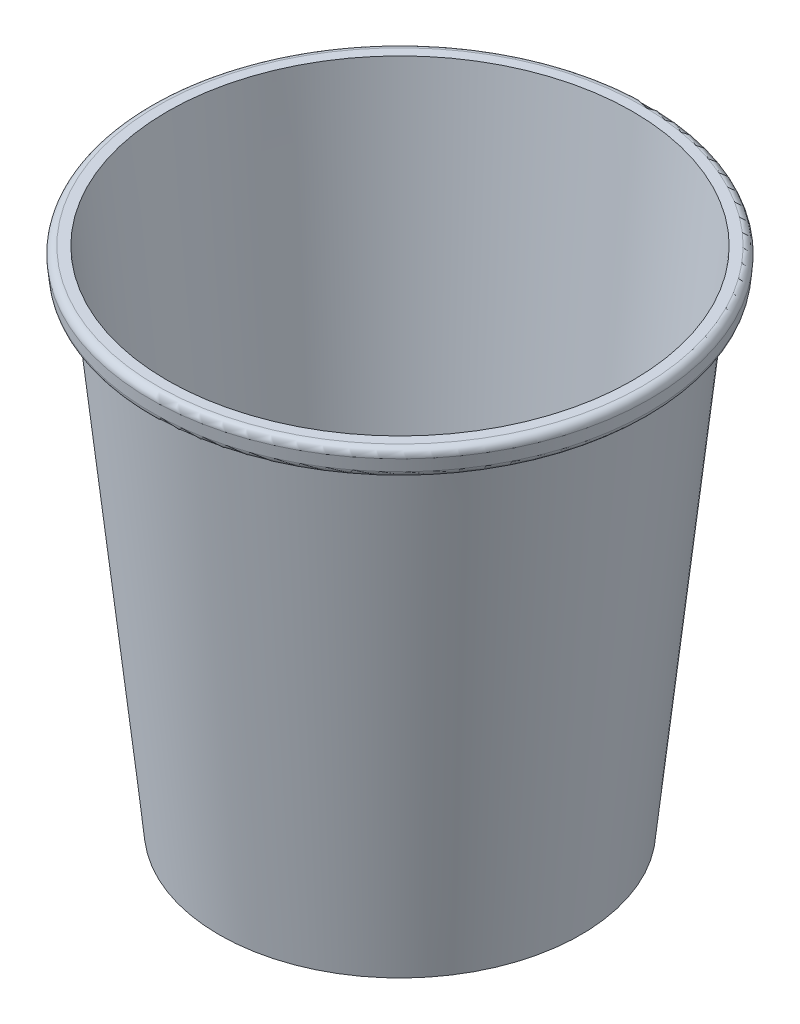
ISO-10303-21;
HEADER;
FILE_DESCRIPTION(('STEP AP214'),'2;1');
FILE_NAME('part.step','',(''),(''),'','','');
FILE_SCHEMA(('AUTOMOTIVE_DESIGN { 1 0 10303 214 1 1 1 1 }'));
ENDSEC;
DATA;
#1=APPLICATION_CONTEXT('core data for automotive mechanical design processes');
#2=APPLICATION_PROTOCOL_DEFINITION('international standard','automotive_design',2000,#1);
#3=PRODUCT_CONTEXT('',#1,'mechanical');
#4=PRODUCT('Part','Part','',(#3));
#5=PRODUCT_RELATED_PRODUCT_CATEGORY('part','',(#4));
#6=PRODUCT_DEFINITION_FORMATION('','',#4);
#7=PRODUCT_DEFINITION_CONTEXT('part definition',#1,'design');
#8=PRODUCT_DEFINITION('design','',#6,#7);
#9=PRODUCT_DEFINITION_SHAPE('','',#8);
#10=(LENGTH_UNIT() NAMED_UNIT(*) SI_UNIT(.MILLI.,.METRE.));
#11=(NAMED_UNIT(*) PLANE_ANGLE_UNIT() SI_UNIT($,.RADIAN.));
#12=(NAMED_UNIT(*) SI_UNIT($,.STERADIAN.) SOLID_ANGLE_UNIT());
#13=UNCERTAINTY_MEASURE_WITH_UNIT(LENGTH_MEASURE(1.E-05),#10,'distance_accuracy_value','');
#14=(GEOMETRIC_REPRESENTATION_CONTEXT(3) GLOBAL_UNCERTAINTY_ASSIGNED_CONTEXT((#13)) GLOBAL_UNIT_ASSIGNED_CONTEXT((#10,
#11,#12)) REPRESENTATION_CONTEXT('',''));
#15=CARTESIAN_POINT('',(0.,0.,0.));
#16=DIRECTION('',(0.,0.,1.));
#17=DIRECTION('',(1.,0.,0.));
#18=AXIS2_PLACEMENT_3D('',#15,#16,#17);
#19=CARTESIAN_POINT('',(0.,-0.0266084031292856,0.));
#20=DIRECTION('',(0.,1.,0.));
#21=DIRECTION('',(0.,0.,1.));
#22=AXIS2_PLACEMENT_3D('',#19,#20,#21);
#23=CONICAL_SURFACE('',#22,32.320102440374,0.10495004883392);
#24=CARTESIAN_POINT('',(0.,0.,0.));
#25=DIRECTION('',(0.,1.,0.));
#26=DIRECTION('',(0.,0.,1.));
#27=AXIS2_PLACEMENT_3D('',#24,#25,#26);
#28=CIRCLE('',#27,32.3229052918272);
#29=CARTESIAN_POINT('',(0.,0.,32.3229052918272));
#30=VERTEX_POINT('',#29);
#31=EDGE_CURVE('E57',#30,#30,#28,.T.);
#32=ORIENTED_EDGE('',*,*,#31,.T.);
#33=EDGE_LOOP('',(#32));
#34=FACE_BOUND('',#33,.T.);
#35=CARTESIAN_POINT('',(0.,90.17,0.));
#36=DIRECTION('',(0.,1.,0.));
#37=DIRECTION('',(0.,0.,1.));
#38=AXIS2_PLACEMENT_3D('',#35,#36,#37);
#39=CIRCLE('',#38,41.8211496738497);
#40=CARTESIAN_POINT('',(41.8211496738497,90.1700000000003,0.));
#41=VERTEX_POINT('',#40);
#42=EDGE_CURVE('E12',#41,#41,#39,.F.);
#43=ORIENTED_EDGE('',*,*,#42,.T.);
#44=EDGE_LOOP('',(#43));
#45=FACE_BOUND('',#44,.T.);
#46=ADVANCED_FACE('F49',(#34,#45),#23,.T.);
#47=CARTESIAN_POINT('',(0.,0.,0.));
#48=DIRECTION('',(0.,1.,0.));
#49=DIRECTION('',(0.,0.,1.));
#50=AXIS2_PLACEMENT_3D('',#47,#48,#49);
#51=PLANE('',#50);
#52=ORIENTED_EDGE('',*,*,#31,.F.);
#53=EDGE_LOOP('',(#52));
#54=FACE_BOUND('',#53,.T.);
#55=CARTESIAN_POINT('',(0.,0.,0.));
#56=DIRECTION('',(0.,1.,0.));
#57=DIRECTION('',(0.,0.,1.));
#58=AXIS2_PLACEMENT_3D('',#55,#56,#57);
#59=CIRCLE('',#58,32.0675);
#60=CARTESIAN_POINT('',(0.,0.,32.0675));
#61=VERTEX_POINT('',#60);
#62=EDGE_CURVE('E179',#61,#61,#59,.T.);
#63=ORIENTED_EDGE('',*,*,#62,.T.);
#64=EDGE_LOOP('',(#63));
#65=FACE_BOUND('',#64,.T.);
#66=ADVANCED_FACE('F188',(#54,#65),#51,.F.);
#67=CARTESIAN_POINT('',(0.,90.424,0.));
#68=DIRECTION('',(0.,1.,0.));
#69=DIRECTION('',(0.,0.,1.));
#70=AXIS2_PLACEMENT_3D('',#67,#68,#69);
#71=PLANE('',#70);
#72=CARTESIAN_POINT('',(0.,90.424,0.));
#73=DIRECTION('',(0.,1.,0.));
#74=DIRECTION('',(0.,0.,1.));
#75=AXIS2_PLACEMENT_3D('',#72,#73,#74);
#76=CIRCLE('',#75,41.5925);
#77=CARTESIAN_POINT('',(0.,90.424,41.5925));
#78=VERTEX_POINT('',#77);
#79=EDGE_CURVE('E174',#78,#78,#76,.T.);
#80=ORIENTED_EDGE('',*,*,#79,.F.);
#81=EDGE_LOOP('',(#80));
#82=FACE_BOUND('',#81,.T.);
#83=CARTESIAN_POINT('',(0.,90.424,0.));
#84=DIRECTION('',(0.,1.,0.));
#85=DIRECTION('',(1.,0.,0.));
#86=AXIS2_PLACEMENT_3D('',#83,#84,#85);
#87=CIRCLE('',#86,43.3566954509761);
#88=CARTESIAN_POINT('',(43.3566954509761,90.424,0.));
#89=VERTEX_POINT('',#88);
#90=EDGE_CURVE('E170',#89,#89,#87,.T.);
#91=ORIENTED_EDGE('',*,*,#90,.T.);
#92=EDGE_LOOP('',(#91));
#93=FACE_BOUND('',#92,.T.);
#94=ADVANCED_FACE('F191',(#82,#93),#71,.T.);
#95=CARTESIAN_POINT('',(0.,0.,0.));
#96=DIRECTION('',(0.,1.,0.));
#97=DIRECTION('',(0.,0.,1.));
#98=AXIS2_PLACEMENT_3D('',#95,#96,#97);
#99=CONICAL_SURFACE('',#98,32.0675,0.10495004883392);
#100=ORIENTED_EDGE('',*,*,#79,.T.);
#101=EDGE_LOOP('',(#100));
#102=FACE_BOUND('',#101,.T.);
#103=ORIENTED_EDGE('',*,*,#62,.F.);
#104=EDGE_LOOP('',(#103));
#105=FACE_BOUND('',#104,.T.);
#106=ADVANCED_FACE('F194',(#102,#105),#99,.F.);
#107=CARTESIAN_POINT('',(41.5925,90.17,0.));
#108=DIRECTION('',(0.,1.,0.));
#109=DIRECTION('',(0.,0.,1.));
#110=AXIS2_PLACEMENT_3D('',#107,#108,#109);
#111=PLANE('',#110);
#112=ORIENTED_EDGE('',*,*,#42,.F.);
#113=EDGE_LOOP('',(#112));
#114=FACE_BOUND('',#113,.T.);
#115=CARTESIAN_POINT('',(0.,90.17,0.));
#116=DIRECTION('',(0.,1.,0.));
#117=DIRECTION('',(1.,0.,0.));
#118=AXIS2_PLACEMENT_3D('',#115,#116,#117);
#119=CIRCLE('',#118,43.3566954509761);
#120=CARTESIAN_POINT('',(43.3566954509761,90.17,0.));
#121=VERTEX_POINT('',#120);
#122=EDGE_CURVE('E101',#121,#121,#119,.T.);
#123=ORIENTED_EDGE('',*,*,#122,.F.);
#124=EDGE_LOOP('',(#123));
#125=FACE_BOUND('',#124,.T.);
#126=ADVANCED_FACE('F100',(#114,#125),#111,.F.);
#127=CARTESIAN_POINT('',(0.,89.154,0.));
#128=DIRECTION('',(0.,1.,0.));
#129=DIRECTION('',(0.,0.,1.));
#130=AXIS2_PLACEMENT_3D('',#127,#128,#129);
#131=TOROIDAL_SURFACE('',#130,43.3566954509761,1.016);
#132=CARTESIAN_POINT('',(43.3566954509761,89.154,0.));
#133=DIRECTION('',(0.,0.,-1.));
#134=DIRECTION('',(1.,0.,0.));
#135=AXIS2_PLACEMENT_3D('',#132,#133,#134);
#136=CIRCLE('',#135,1.016);
#137=CARTESIAN_POINT('',(44.3671052124722,89.0475663874829,0.));
#138=VERTEX_POINT('',#137);
#139=EDGE_CURVE('E104',#121,#138,#136,.T.);
#140=ORIENTED_EDGE('',*,*,#139,.T.);
#141=CARTESIAN_POINT('',(0.,89.0475663874829,0.));
#142=DIRECTION('',(0.,1.,0.));
#143=DIRECTION('',(1.,0.,0.));
#144=AXIS2_PLACEMENT_3D('',#141,#142,#143);
#145=CIRCLE('',#144,44.3671052124722);
#146=EDGE_CURVE('E111',#138,#138,#145,.T.);
#147=ORIENTED_EDGE('',*,*,#146,.F.);
#148=ORIENTED_EDGE('',*,*,#139,.F.);
#149=ORIENTED_EDGE('',*,*,#122,.T.);
#150=EDGE_LOOP('',(#140,#147,#148,#149));
#151=FACE_BOUND('',#150,.T.);
#152=ADVANCED_FACE('F107',(#151),#131,.F.);
#153=CARTESIAN_POINT('',(0.,89.0475663874829,0.));
#154=DIRECTION('',(0.,1.,0.));
#155=DIRECTION('',(0.,0.,1.));
#156=AXIS2_PLACEMENT_3D('',#153,#154,#155);
#157=CONICAL_SURFACE('',#156,44.3671052124722,0.104950048833919);
#158=DIRECTION('',(-0.104757492634982,-0.994497796748103,0.));
#159=VECTOR('',#158,1.);
#160=CARTESIAN_POINT('',(44.3671052124722,89.0475663874829,0.));
#161=LINE('',#160,#159);
#162=CARTESIAN_POINT('',(44.1396824596632,86.8885663874829,0.));
#163=VERTEX_POINT('',#162);
#164=EDGE_CURVE('E121',#138,#163,#161,.T.);
#165=ORIENTED_EDGE('',*,*,#164,.T.);
#166=CARTESIAN_POINT('',(0.,86.8885663874829,0.));
#167=DIRECTION('',(0.,1.,0.));
#168=DIRECTION('',(1.,0.,0.));
#169=AXIS2_PLACEMENT_3D('',#166,#167,#168);
#170=CIRCLE('',#169,44.1396824596632);
#171=EDGE_CURVE('E115',#163,#163,#170,.T.);
#172=ORIENTED_EDGE('',*,*,#171,.F.);
#173=ORIENTED_EDGE('',*,*,#164,.F.);
#174=ORIENTED_EDGE('',*,*,#146,.T.);
#175=EDGE_LOOP('',(#165,#172,#173,#174));
#176=FACE_BOUND('',#175,.T.);
#177=ADVANCED_FACE('F236',(#176),#157,.F.);
#178=CARTESIAN_POINT('',(0.,86.995,0.));
#179=DIRECTION('',(0.,1.,0.));
#180=DIRECTION('',(0.,0.,1.));
#181=AXIS2_PLACEMENT_3D('',#178,#179,#180);
#182=TOROIDAL_SURFACE('',#181,43.1292726981671,1.01599999999999);
#183=CARTESIAN_POINT('',(43.1292726981671,86.995,0.));
#184=DIRECTION('',(0.,0.,-1.));
#185=DIRECTION('',(-1.,0.,0.));
#186=AXIS2_PLACEMENT_3D('',#183,#184,#185);
#187=CIRCLE('',#186,1.01599999999999);
#188=CARTESIAN_POINT('',(43.1292726981671,85.979,0.));
#189=VERTEX_POINT('',#188);
#190=EDGE_CURVE('E125',#163,#189,#187,.T.);
#191=ORIENTED_EDGE('',*,*,#190,.T.);
#192=CARTESIAN_POINT('',(0.,85.979,0.));
#193=DIRECTION('',(0.,1.,0.));
#194=DIRECTION('',(1.,0.,0.));
#195=AXIS2_PLACEMENT_3D('',#192,#193,#194);
#196=CIRCLE('',#195,43.1292726981671);
#197=EDGE_CURVE('E129',#189,#189,#196,.T.);
#198=ORIENTED_EDGE('',*,*,#197,.F.);
#199=ORIENTED_EDGE('',*,*,#190,.F.);
#200=ORIENTED_EDGE('',*,*,#171,.T.);
#201=EDGE_LOOP('',(#191,#198,#199,#200));
#202=FACE_BOUND('',#201,.T.);
#203=ADVANCED_FACE('F245',(#202),#182,.F.);
#204=CARTESIAN_POINT('',(43.1292726981671,85.979,0.));
#205=DIRECTION('',(0.,-1.,0.));
#206=DIRECTION('',(0.,0.,-1.));
#207=AXIS2_PLACEMENT_3D('',#204,#205,#206);
#208=PLANE('',#207);
#209=ORIENTED_EDGE('',*,*,#197,.T.);
#210=EDGE_LOOP('',(#209));
#211=FACE_BOUND('',#210,.T.);
#212=CARTESIAN_POINT('',(0.,85.979,0.));
#213=DIRECTION('',(0.,1.,0.));
#214=DIRECTION('',(1.,0.,0.));
#215=AXIS2_PLACEMENT_3D('',#212,#213,#214);
#216=CIRCLE('',#215,43.0025210674157);
#217=CARTESIAN_POINT('',(43.0025210674157,85.979,0.));
#218=VERTEX_POINT('',#217);
#219=EDGE_CURVE('E136',#218,#218,#216,.T.);
#220=ORIENTED_EDGE('',*,*,#219,.F.);
#221=EDGE_LOOP('',(#220));
#222=FACE_BOUND('',#221,.T.);
#223=ADVANCED_FACE('F255',(#211,#222),#208,.F.);
#224=CARTESIAN_POINT('',(0.,90.424,0.));
#225=DIRECTION('',(0.,1.,0.));
#226=DIRECTION('',(0.,0.,1.));
#227=AXIS2_PLACEMENT_3D('',#224,#225,#226);
#228=CYLINDRICAL_SURFACE('',#227,43.0025210674157);
#229=DIRECTION('',(0.,-1.,0.));
#230=VECTOR('',#229,1.);
#231=CARTESIAN_POINT('',(43.0025210674157,85.725,0.));
#232=LINE('',#231,#230);
#233=CARTESIAN_POINT('',(43.0025210674157,85.725,0.));
#234=VERTEX_POINT('',#233);
#235=EDGE_CURVE('E139',#218,#234,#232,.T.);
#236=ORIENTED_EDGE('',*,*,#235,.T.);
#237=CARTESIAN_POINT('',(0.,85.725,0.));
#238=DIRECTION('',(0.,1.,0.));
#239=DIRECTION('',(1.,0.,0.));
#240=AXIS2_PLACEMENT_3D('',#237,#238,#239);
#241=CIRCLE('',#240,43.0025210674157);
#242=EDGE_CURVE('E143',#234,#234,#241,.T.);
#243=ORIENTED_EDGE('',*,*,#242,.F.);
#244=ORIENTED_EDGE('',*,*,#235,.F.);
#245=ORIENTED_EDGE('',*,*,#219,.T.);
#246=EDGE_LOOP('',(#236,#243,#244,#245));
#247=FACE_BOUND('',#246,.T.);
#248=ADVANCED_FACE('F265',(#247),#228,.F.);
#249=CARTESIAN_POINT('',(43.1292726981671,85.725,0.));
#250=DIRECTION('',(0.,1.,0.));
#251=DIRECTION('',(0.,0.,1.));
#252=AXIS2_PLACEMENT_3D('',#249,#250,#251);
#253=PLANE('',#252);
#254=ORIENTED_EDGE('',*,*,#242,.T.);
#255=EDGE_LOOP('',(#254));
#256=FACE_BOUND('',#255,.T.);
#257=CARTESIAN_POINT('',(0.,85.725,0.));
#258=DIRECTION('',(0.,1.,0.));
#259=DIRECTION('',(1.,0.,0.));
#260=AXIS2_PLACEMENT_3D('',#257,#258,#259);
#261=CIRCLE('',#260,43.1292726981671);
#262=CARTESIAN_POINT('',(43.1292726981671,85.725,0.));
#263=VERTEX_POINT('',#262);
#264=EDGE_CURVE('E150',#263,#263,#261,.T.);
#265=ORIENTED_EDGE('',*,*,#264,.F.);
#266=EDGE_LOOP('',(#265));
#267=FACE_BOUND('',#266,.T.);
#268=ADVANCED_FACE('F275',(#256,#267),#253,.F.);
#269=CARTESIAN_POINT('',(0.,86.995,0.));
#270=DIRECTION('',(0.,1.,0.));
#271=DIRECTION('',(0.,0.,1.));
#272=AXIS2_PLACEMENT_3D('',#269,#270,#271);
#273=TOROIDAL_SURFACE('',#272,43.1292726981671,1.27);
#274=CARTESIAN_POINT('',(43.1292726981671,86.995,0.));
#275=DIRECTION('',(0.,0.,1.));
#276=DIRECTION('',(-1.,0.,0.));
#277=AXIS2_PLACEMENT_3D('',#274,#275,#276);
#278=CIRCLE('',#277,1.27);
#279=CARTESIAN_POINT('',(44.3922849000372,86.8619579843536,0.));
#280=VERTEX_POINT('',#279);
#281=EDGE_CURVE('E153',#263,#280,#278,.T.);
#282=ORIENTED_EDGE('',*,*,#281,.T.);
#283=CARTESIAN_POINT('',(0.,86.8619579843536,0.));
#284=DIRECTION('',(0.,1.,0.));
#285=DIRECTION('',(1.,0.,0.));
#286=AXIS2_PLACEMENT_3D('',#283,#284,#285);
#287=CIRCLE('',#286,44.3922849000372);
#288=EDGE_CURVE('E157',#280,#280,#287,.T.);
#289=ORIENTED_EDGE('',*,*,#288,.F.);
#290=ORIENTED_EDGE('',*,*,#281,.F.);
#291=ORIENTED_EDGE('',*,*,#264,.T.);
#292=EDGE_LOOP('',(#282,#289,#290,#291));
#293=FACE_BOUND('',#292,.T.);
#294=ADVANCED_FACE('F285',(#293),#273,.T.);
#295=CARTESIAN_POINT('',(0.,86.8619579843536,0.));
#296=DIRECTION('',(0.,1.,0.));
#297=DIRECTION('',(0.,0.,1.));
#298=AXIS2_PLACEMENT_3D('',#295,#296,#297);
#299=CONICAL_SURFACE('',#298,44.3922849000372,0.10495004883392);
#300=DIRECTION('',(0.104757492634983,0.994497796748103,0.));
#301=VECTOR('',#300,1.);
#302=CARTESIAN_POINT('',(44.6197076528462,89.0209579843536,0.));
#303=LINE('',#302,#301);
#304=CARTESIAN_POINT('',(44.6197076528462,89.0209579843536,0.));
#305=VERTEX_POINT('',#304);
#306=EDGE_CURVE('E160',#280,#305,#303,.T.);
#307=ORIENTED_EDGE('',*,*,#306,.T.);
#308=CARTESIAN_POINT('',(0.,89.0209579843536,0.));
#309=DIRECTION('',(0.,1.,0.));
#310=DIRECTION('',(1.,0.,0.));
#311=AXIS2_PLACEMENT_3D('',#308,#309,#310);
#312=CIRCLE('',#311,44.6197076528462);
#313=EDGE_CURVE('E164',#305,#305,#312,.T.);
#314=ORIENTED_EDGE('',*,*,#313,.F.);
#315=ORIENTED_EDGE('',*,*,#306,.F.);
#316=ORIENTED_EDGE('',*,*,#288,.T.);
#317=EDGE_LOOP('',(#307,#314,#315,#316));
#318=FACE_BOUND('',#317,.T.);
#319=ADVANCED_FACE('F295',(#318),#299,.T.);
#320=CARTESIAN_POINT('',(0.,89.154,0.));
#321=DIRECTION('',(0.,1.,0.));
#322=DIRECTION('',(0.,0.,1.));
#323=AXIS2_PLACEMENT_3D('',#320,#321,#322);
#324=TOROIDAL_SURFACE('',#323,43.3566954509761,1.27);
#325=CARTESIAN_POINT('',(43.3566954509761,89.154,0.));
#326=DIRECTION('',(0.,0.,1.));
#327=DIRECTION('',(1.,0.,0.));
#328=AXIS2_PLACEMENT_3D('',#325,#326,#327);
#329=CIRCLE('',#328,1.27);
#330=EDGE_CURVE('E117',#305,#89,#329,.T.);
#331=ORIENTED_EDGE('',*,*,#330,.T.);
#332=ORIENTED_EDGE('',*,*,#90,.F.);
#333=ORIENTED_EDGE('',*,*,#330,.F.);
#334=ORIENTED_EDGE('',*,*,#313,.T.);
#335=EDGE_LOOP('',(#331,#332,#333,#334));
#336=FACE_BOUND('',#335,.T.);
#337=ADVANCED_FACE('F305',(#336),#324,.T.);
#338=CLOSED_SHELL('',(#46,#66,#94,#106,#126,#152,#177,#203,#223,#248,#268,#294,#319,#337));
#339=MANIFOLD_SOLID_BREP('B2',#338);
#340=ADVANCED_BREP_SHAPE_REPRESENTATION('',(#18,#339),#14);
#341=SHAPE_DEFINITION_REPRESENTATION(#9,#340);
ENDSEC;
END-ISO-10303-21;
